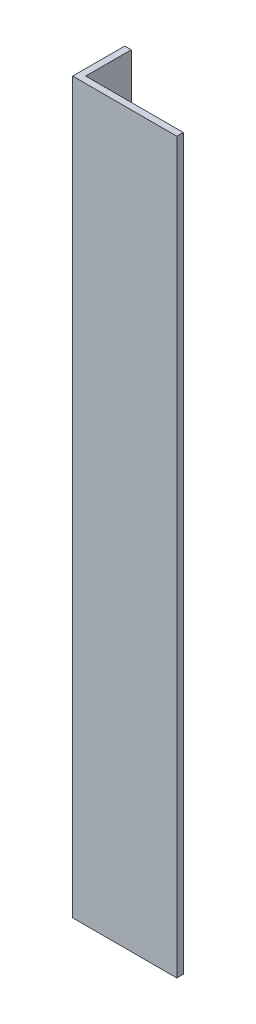
ISO-10303-21;
HEADER;
FILE_DESCRIPTION(('STEP AP214'),'2;1');
FILE_NAME('part.step','',(''),(''),'','','');
FILE_SCHEMA(('AUTOMOTIVE_DESIGN { 1 0 10303 214 1 1 1 1 }'));
ENDSEC;
DATA;
#1=APPLICATION_CONTEXT('core data for automotive mechanical design processes');
#2=APPLICATION_PROTOCOL_DEFINITION('international standard','automotive_design',2000,#1);
#3=PRODUCT_CONTEXT('',#1,'mechanical');
#4=PRODUCT('Part','Part','',(#3));
#5=PRODUCT_RELATED_PRODUCT_CATEGORY('part','',(#4));
#6=PRODUCT_DEFINITION_FORMATION('','',#4);
#7=PRODUCT_DEFINITION_CONTEXT('part definition',#1,'design');
#8=PRODUCT_DEFINITION('design','',#6,#7);
#9=PRODUCT_DEFINITION_SHAPE('','',#8);
#10=(LENGTH_UNIT() NAMED_UNIT(*) SI_UNIT(.MILLI.,.METRE.));
#11=(NAMED_UNIT(*) PLANE_ANGLE_UNIT() SI_UNIT($,.RADIAN.));
#12=(NAMED_UNIT(*) SI_UNIT($,.STERADIAN.) SOLID_ANGLE_UNIT());
#13=UNCERTAINTY_MEASURE_WITH_UNIT(LENGTH_MEASURE(1.E-05),#10,'distance_accuracy_value','');
#14=(GEOMETRIC_REPRESENTATION_CONTEXT(3) GLOBAL_UNCERTAINTY_ASSIGNED_CONTEXT((#13)) GLOBAL_UNIT_ASSIGNED_CONTEXT((#10,
#11,#12)) REPRESENTATION_CONTEXT('',''));
#15=CARTESIAN_POINT('',(0.,0.,0.));
#16=DIRECTION('',(0.,0.,1.));
#17=DIRECTION('',(1.,0.,0.));
#18=AXIS2_PLACEMENT_3D('',#15,#16,#17);
#19=CARTESIAN_POINT('',(0.,355.6,0.));
#20=DIRECTION('',(1.,0.,0.));
#21=DIRECTION('',(0.,0.,-1.));
#22=AXIS2_PLACEMENT_3D('',#19,#20,#21);
#23=PLANE('',#22);
#24=DIRECTION('',(0.,0.,1.));
#25=VECTOR('',#24,1.);
#26=CARTESIAN_POINT('',(0.,0.,0.));
#27=LINE('',#26,#25);
#28=CARTESIAN_POINT('',(0.,0.,-25.4));
#29=VERTEX_POINT('',#28);
#30=CARTESIAN_POINT('',(0.,0.,0.));
#31=VERTEX_POINT('',#30);
#32=EDGE_CURVE('E129',#29,#31,#27,.T.);
#33=ORIENTED_EDGE('',*,*,#32,.T.);
#34=DIRECTION('',(0.,-1.,0.));
#35=VECTOR('',#34,1.);
#36=CARTESIAN_POINT('',(0.,355.6,0.));
#37=LINE('',#36,#35);
#38=CARTESIAN_POINT('',(0.,355.6,0.));
#39=VERTEX_POINT('',#38);
#40=EDGE_CURVE('E11',#39,#31,#37,.T.);
#41=ORIENTED_EDGE('',*,*,#40,.F.);
#42=DIRECTION('',(0.,0.,1.));
#43=VECTOR('',#42,1.);
#44=CARTESIAN_POINT('',(0.,355.6,0.));
#45=LINE('',#44,#43);
#46=CARTESIAN_POINT('',(0.,355.6,-25.4));
#47=VERTEX_POINT('',#46);
#48=EDGE_CURVE('E145',#47,#39,#45,.T.);
#49=ORIENTED_EDGE('',*,*,#48,.F.);
#50=DIRECTION('',(0.,-1.,0.));
#51=VECTOR('',#50,1.);
#52=CARTESIAN_POINT('',(0.,355.6,-25.4));
#53=LINE('',#52,#51);
#54=EDGE_CURVE('E125',#47,#29,#53,.T.);
#55=ORIENTED_EDGE('',*,*,#54,.T.);
#56=EDGE_LOOP('',(#33,#41,#49,#55));
#57=FACE_BOUND('',#56,.T.);
#58=ADVANCED_FACE('F39',(#57),#23,.F.);
#59=CARTESIAN_POINT('',(0.,355.6,0.));
#60=DIRECTION('',(0.,0.,-1.));
#61=DIRECTION('',(-1.,0.,0.));
#62=AXIS2_PLACEMENT_3D('',#59,#60,#61);
#63=PLANE('',#62);
#64=DIRECTION('',(1.,0.,0.));
#65=VECTOR('',#64,1.);
#66=CARTESIAN_POINT('',(0.,0.,0.));
#67=LINE('',#66,#65);
#68=CARTESIAN_POINT('',(50.8,0.,0.));
#69=VERTEX_POINT('',#68);
#70=EDGE_CURVE('E133',#31,#69,#67,.T.);
#71=ORIENTED_EDGE('',*,*,#70,.T.);
#72=DIRECTION('',(0.,-1.,0.));
#73=VECTOR('',#72,1.);
#74=CARTESIAN_POINT('',(50.8,355.6,0.));
#75=LINE('',#74,#73);
#76=CARTESIAN_POINT('',(50.8,355.6,0.));
#77=VERTEX_POINT('',#76);
#78=EDGE_CURVE('E47',#77,#69,#75,.T.);
#79=ORIENTED_EDGE('',*,*,#78,.F.);
#80=DIRECTION('',(1.,0.,0.));
#81=VECTOR('',#80,1.);
#82=CARTESIAN_POINT('',(0.,355.6,0.));
#83=LINE('',#82,#81);
#84=EDGE_CURVE('E97',#39,#77,#83,.T.);
#85=ORIENTED_EDGE('',*,*,#84,.F.);
#86=ORIENTED_EDGE('',*,*,#40,.T.);
#87=EDGE_LOOP('',(#71,#79,#85,#86));
#88=FACE_BOUND('',#87,.T.);
#89=ADVANCED_FACE('F173',(#88),#63,.F.);
#90=CARTESIAN_POINT('',(50.8,355.6,0.));
#91=DIRECTION('',(-1.,0.,0.));
#92=DIRECTION('',(0.,0.,1.));
#93=AXIS2_PLACEMENT_3D('',#90,#91,#92);
#94=PLANE('',#93);
#95=DIRECTION('',(0.,0.,-1.));
#96=VECTOR('',#95,1.);
#97=CARTESIAN_POINT('',(50.8,0.,0.));
#98=LINE('',#97,#96);
#99=CARTESIAN_POINT('',(50.8,0.,-3.175));
#100=VERTEX_POINT('',#99);
#101=EDGE_CURVE('E136',#69,#100,#98,.T.);
#102=ORIENTED_EDGE('',*,*,#101,.T.);
#103=DIRECTION('',(0.,-1.,0.));
#104=VECTOR('',#103,1.);
#105=CARTESIAN_POINT('',(50.8,355.6,-3.175));
#106=LINE('',#105,#104);
#107=CARTESIAN_POINT('',(50.8,355.6,-3.175));
#108=VERTEX_POINT('',#107);
#109=EDGE_CURVE('E120',#108,#100,#106,.T.);
#110=ORIENTED_EDGE('',*,*,#109,.F.);
#111=DIRECTION('',(0.,0.,-1.));
#112=VECTOR('',#111,1.);
#113=CARTESIAN_POINT('',(50.8,355.6,0.));
#114=LINE('',#113,#112);
#115=EDGE_CURVE('E110',#77,#108,#114,.T.);
#116=ORIENTED_EDGE('',*,*,#115,.F.);
#117=ORIENTED_EDGE('',*,*,#78,.T.);
#118=EDGE_LOOP('',(#102,#110,#116,#117));
#119=FACE_BOUND('',#118,.T.);
#120=ADVANCED_FACE('F155',(#119),#94,.F.);
#121=CARTESIAN_POINT('',(3.175,355.6,-3.175));
#122=DIRECTION('',(0.,0.,1.));
#123=DIRECTION('',(1.,0.,0.));
#124=AXIS2_PLACEMENT_3D('',#121,#122,#123);
#125=PLANE('',#124);
#126=DIRECTION('',(-1.,0.,0.));
#127=VECTOR('',#126,1.);
#128=CARTESIAN_POINT('',(3.175,0.,-3.175));
#129=LINE('',#128,#127);
#130=CARTESIAN_POINT('',(3.175,0.,-3.175));
#131=VERTEX_POINT('',#130);
#132=EDGE_CURVE('E118',#100,#131,#129,.T.);
#133=ORIENTED_EDGE('',*,*,#132,.T.);
#134=DIRECTION('',(0.,-1.,0.));
#135=VECTOR('',#134,1.);
#136=CARTESIAN_POINT('',(3.175,355.6,-3.175));
#137=LINE('',#136,#135);
#138=CARTESIAN_POINT('',(3.175,355.6,-3.175));
#139=VERTEX_POINT('',#138);
#140=EDGE_CURVE('E115',#139,#131,#137,.T.);
#141=ORIENTED_EDGE('',*,*,#140,.F.);
#142=DIRECTION('',(-1.,0.,0.));
#143=VECTOR('',#142,1.);
#144=CARTESIAN_POINT('',(3.175,355.6,-3.175));
#145=LINE('',#144,#143);
#146=EDGE_CURVE('E104',#108,#139,#145,.T.);
#147=ORIENTED_EDGE('',*,*,#146,.F.);
#148=ORIENTED_EDGE('',*,*,#109,.T.);
#149=EDGE_LOOP('',(#133,#141,#147,#148));
#150=FACE_BOUND('',#149,.T.);
#151=ADVANCED_FACE('F116',(#150),#125,.F.);
#152=CARTESIAN_POINT('',(3.175,355.6,-3.175));
#153=DIRECTION('',(-1.,0.,0.));
#154=DIRECTION('',(0.,0.,1.));
#155=AXIS2_PLACEMENT_3D('',#152,#153,#154);
#156=PLANE('',#155);
#157=DIRECTION('',(0.,0.,-1.));
#158=VECTOR('',#157,1.);
#159=CARTESIAN_POINT('',(3.175,0.,-3.175));
#160=LINE('',#159,#158);
#161=CARTESIAN_POINT('',(3.175,0.,-25.4));
#162=VERTEX_POINT('',#161);
#163=EDGE_CURVE('E83',#131,#162,#160,.T.);
#164=ORIENTED_EDGE('',*,*,#163,.T.);
#165=DIRECTION('',(0.,-1.,0.));
#166=VECTOR('',#165,1.);
#167=CARTESIAN_POINT('',(3.175,355.6,-25.4));
#168=LINE('',#167,#166);
#169=CARTESIAN_POINT('',(3.175,355.6,-25.4));
#170=VERTEX_POINT('',#169);
#171=EDGE_CURVE('E121',#170,#162,#168,.T.);
#172=ORIENTED_EDGE('',*,*,#171,.F.);
#173=DIRECTION('',(0.,0.,-1.));
#174=VECTOR('',#173,1.);
#175=CARTESIAN_POINT('',(3.175,355.6,-3.175));
#176=LINE('',#175,#174);
#177=EDGE_CURVE('E108',#139,#170,#176,.T.);
#178=ORIENTED_EDGE('',*,*,#177,.F.);
#179=ORIENTED_EDGE('',*,*,#140,.T.);
#180=EDGE_LOOP('',(#164,#172,#178,#179));
#181=FACE_BOUND('',#180,.T.);
#182=ADVANCED_FACE('F123',(#181),#156,.F.);
#183=CARTESIAN_POINT('',(0.,355.6,-25.4));
#184=DIRECTION('',(0.,0.,1.));
#185=DIRECTION('',(1.,0.,0.));
#186=AXIS2_PLACEMENT_3D('',#183,#184,#185);
#187=PLANE('',#186);
#188=DIRECTION('',(-1.,0.,0.));
#189=VECTOR('',#188,1.);
#190=CARTESIAN_POINT('',(0.,0.,-25.4));
#191=LINE('',#190,#189);
#192=EDGE_CURVE('E89',#162,#29,#191,.T.);
#193=ORIENTED_EDGE('',*,*,#192,.T.);
#194=ORIENTED_EDGE('',*,*,#54,.F.);
#195=DIRECTION('',(-1.,0.,0.));
#196=VECTOR('',#195,1.);
#197=CARTESIAN_POINT('',(0.,355.6,-25.4));
#198=LINE('',#197,#196);
#199=EDGE_CURVE('E55',#170,#47,#198,.T.);
#200=ORIENTED_EDGE('',*,*,#199,.F.);
#201=ORIENTED_EDGE('',*,*,#171,.T.);
#202=EDGE_LOOP('',(#193,#194,#200,#201));
#203=FACE_BOUND('',#202,.T.);
#204=ADVANCED_FACE('F162',(#203),#187,.F.);
#205=CARTESIAN_POINT('',(0.,355.6,0.));
#206=DIRECTION('',(0.,-1.,0.));
#207=DIRECTION('',(0.,0.,-1.));
#208=AXIS2_PLACEMENT_3D('',#205,#206,#207);
#209=PLANE('',#208);
#210=ORIENTED_EDGE('',*,*,#48,.T.);
#211=ORIENTED_EDGE('',*,*,#84,.T.);
#212=ORIENTED_EDGE('',*,*,#115,.T.);
#213=ORIENTED_EDGE('',*,*,#146,.T.);
#214=ORIENTED_EDGE('',*,*,#177,.T.);
#215=ORIENTED_EDGE('',*,*,#199,.T.);
#216=EDGE_LOOP('',(#210,#211,#212,#213,#214,#215));
#217=FACE_BOUND('',#216,.T.);
#218=ADVANCED_FACE('F106',(#217),#209,.F.);
#219=CARTESIAN_POINT('',(0.,0.,0.));
#220=DIRECTION('',(0.,-1.,0.));
#221=DIRECTION('',(0.,0.,-1.));
#222=AXIS2_PLACEMENT_3D('',#219,#220,#221);
#223=PLANE('',#222);
#224=ORIENTED_EDGE('',*,*,#32,.F.);
#225=ORIENTED_EDGE('',*,*,#192,.F.);
#226=ORIENTED_EDGE('',*,*,#163,.F.);
#227=ORIENTED_EDGE('',*,*,#132,.F.);
#228=ORIENTED_EDGE('',*,*,#101,.F.);
#229=ORIENTED_EDGE('',*,*,#70,.F.);
#230=EDGE_LOOP('',(#224,#225,#226,#227,#228,#229));
#231=FACE_BOUND('',#230,.T.);
#232=ADVANCED_FACE('F158',(#231),#223,.T.);
#233=CLOSED_SHELL('',(#58,#89,#120,#151,#182,#204,#218,#232));
#234=MANIFOLD_SOLID_BREP('B2',#233);
#235=ADVANCED_BREP_SHAPE_REPRESENTATION('',(#18,#234),#14);
#236=SHAPE_DEFINITION_REPRESENTATION(#9,#235);
ENDSEC;
END-ISO-10303-21;
